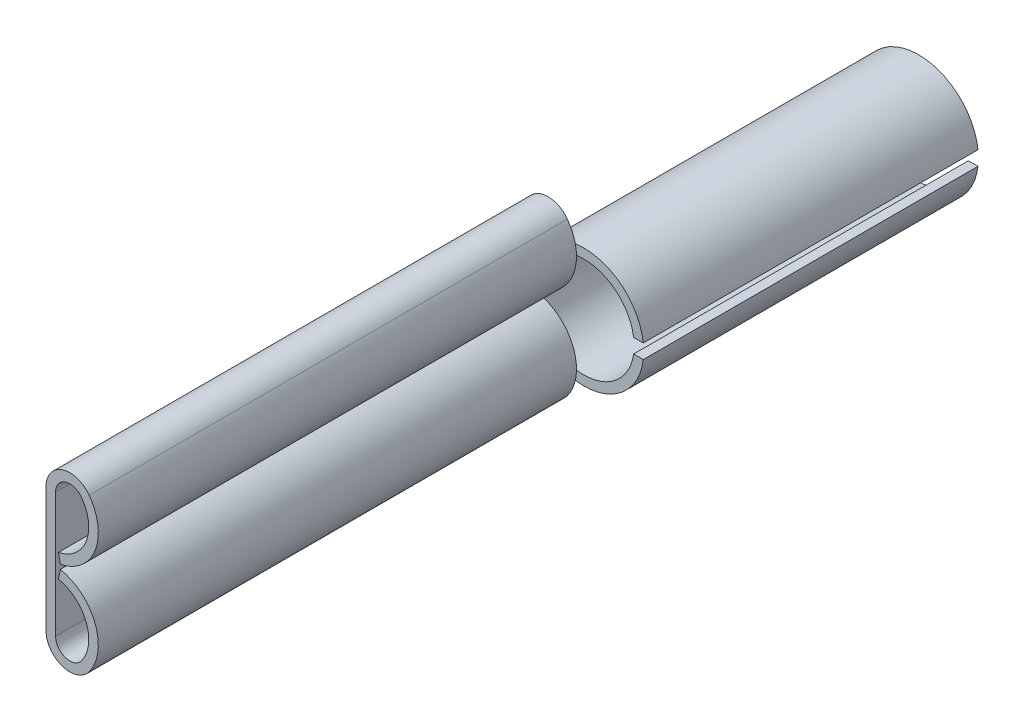
ISO-10303-21;
HEADER;
FILE_DESCRIPTION(('STEP AP214'),'2;1');
FILE_NAME('part.step','',(''),(''),'','','');
FILE_SCHEMA(('AUTOMOTIVE_DESIGN { 1 0 10303 214 1 1 1 1 }'));
ENDSEC;
DATA;
#1=APPLICATION_CONTEXT('core data for automotive mechanical design processes');
#2=APPLICATION_PROTOCOL_DEFINITION('international standard','automotive_design',2000,#1);
#3=PRODUCT_CONTEXT('',#1,'mechanical');
#4=PRODUCT('Part','Part','',(#3));
#5=PRODUCT_RELATED_PRODUCT_CATEGORY('part','',(#4));
#6=PRODUCT_DEFINITION_FORMATION('','',#4);
#7=PRODUCT_DEFINITION_CONTEXT('part definition',#1,'design');
#8=PRODUCT_DEFINITION('design','',#6,#7);
#9=PRODUCT_DEFINITION_SHAPE('','',#8);
#10=(LENGTH_UNIT() NAMED_UNIT(*) SI_UNIT(.MILLI.,.METRE.));
#11=(NAMED_UNIT(*) PLANE_ANGLE_UNIT() SI_UNIT($,.RADIAN.));
#12=(NAMED_UNIT(*) SI_UNIT($,.STERADIAN.) SOLID_ANGLE_UNIT());
#13=UNCERTAINTY_MEASURE_WITH_UNIT(LENGTH_MEASURE(1.E-05),#10,'distance_accuracy_value','');
#14=(GEOMETRIC_REPRESENTATION_CONTEXT(3) GLOBAL_UNCERTAINTY_ASSIGNED_CONTEXT((#13)) GLOBAL_UNIT_ASSIGNED_CONTEXT((#10,
#11,#12)) REPRESENTATION_CONTEXT('',''));
#15=CARTESIAN_POINT('',(0.,0.,0.));
#16=DIRECTION('',(0.,0.,1.));
#17=DIRECTION('',(1.,0.,0.));
#18=AXIS2_PLACEMENT_3D('',#15,#16,#17);
#19=CARTESIAN_POINT('',(0.104531081865318,3.01622247339028,0.));
#20=DIRECTION('',(0.,0.,-1.));
#21=DIRECTION('',(-1.,0.,0.));
#22=AXIS2_PLACEMENT_3D('',#19,#20,#21);
#23=PLANE('',#22);
#24=CARTESIAN_POINT('',(1.25,2.,0.));
#25=DIRECTION('',(0.,0.,1.));
#26=DIRECTION('',(-1.,0.,0.));
#27=AXIS2_PLACEMENT_3D('',#24,#25,#26);
#28=CIRCLE('',#27,1.05);
#29=CARTESIAN_POINT('',(0.893326067712205,1.01243546741169,0.));
#30=VERTEX_POINT('',#29);
#31=CARTESIAN_POINT('',(1.09360041260863,0.961713349279781,0.));
#32=VERTEX_POINT('',#31);
#33=EDGE_CURVE('E37',#30,#32,#28,.T.);
#34=ORIENTED_EDGE('',*,*,#33,.F.);
#35=CARTESIAN_POINT('',(0.104531081865318,0.983777526609717,0.));
#36=DIRECTION('',(0.,0.,-1.));
#37=DIRECTION('',(-1.,0.,0.));
#38=AXIS2_PLACEMENT_3D('',#35,#36,#37);
#39=CIRCLE('',#38,0.789315404175163);
#40=CARTESIAN_POINT('',(0.260484003926401,1.75753297464793,0.));
#41=VERTEX_POINT('',#40);
#42=EDGE_CURVE('E234',#41,#30,#39,.T.);
#43=ORIENTED_EDGE('',*,*,#42,.F.);
#44=DIRECTION('',(-0.197579980367994,-0.980286769959578,0.));
#45=VECTOR('',#44,1.);
#46=CARTESIAN_POINT('',(0.3,1.95359032863984,0.));
#47=LINE('',#46,#45);
#48=CARTESIAN_POINT('',(0.3,1.95359032863984,0.));
#49=VERTEX_POINT('',#48);
#50=EDGE_CURVE('E230',#49,#41,#47,.T.);
#51=ORIENTED_EDGE('',*,*,#50,.F.);
#52=CARTESIAN_POINT('',(0.104531081865318,0.983777526609717,0.));
#53=DIRECTION('',(0.,0.,1.));
#54=DIRECTION('',(-1.,0.,0.));
#55=AXIS2_PLACEMENT_3D('',#52,#53,#54);
#56=CIRCLE('',#55,0.989315404175163);
#57=EDGE_CURVE('E54',#32,#49,#56,.T.);
#58=ORIENTED_EDGE('',*,*,#57,.F.);
#59=EDGE_LOOP('',(#34,#43,#51,#58));
#60=FACE_BOUND('',#59,.T.);
#61=ADVANCED_FACE('F28',(#60),#23,.T.);
#62=CARTESIAN_POINT('',(1.25,2.,0.));
#63=DIRECTION('',(0.,0.,-1.));
#64=DIRECTION('',(-1.,0.,0.));
#65=AXIS2_PLACEMENT_3D('',#62,#63,#64);
#66=CIRCLE('',#65,1.25);
#67=CARTESIAN_POINT('',(1.06893914052776,0.763182727656516,0.));
#68=VERTEX_POINT('',#67);
#69=CARTESIAN_POINT('',(0.874000182773937,0.80789088693779,0.));
#70=VERTEX_POINT('',#69);
#71=EDGE_CURVE('E329',#68,#70,#66,.T.);
#72=ORIENTED_EDGE('',*,*,#71,.F.);
#73=CARTESIAN_POINT('',(0.904104300375872,0.401173340923638,0.));
#74=VERTEX_POINT('',#73);
#75=EDGE_CURVE('E227',#74,#68,#56,.T.);
#76=ORIENTED_EDGE('',*,*,#75,.F.);
#77=CARTESIAN_POINT('',(0.5,0.695621493265824,0.));
#78=DIRECTION('',(0.,0.,1.));
#79=DIRECTION('',(-1.,0.,0.));
#80=AXIS2_PLACEMENT_3D('',#77,#78,#79);
#81=CIRCLE('',#80,0.5);
#82=CARTESIAN_POINT('',(0.,0.695621493265824,0.));
#83=VERTEX_POINT('',#82);
#84=EDGE_CURVE('E225',#83,#74,#81,.T.);
#85=ORIENTED_EDGE('',*,*,#84,.F.);
#86=DIRECTION('',(0.,-1.,0.));
#87=VECTOR('',#86,1.);
#88=CARTESIAN_POINT('',(0.,0.695621493265824,0.));
#89=LINE('',#88,#87);
#90=CARTESIAN_POINT('',(0.,2.,0.));
#91=VERTEX_POINT('',#90);
#92=EDGE_CURVE('E221',#91,#83,#89,.T.);
#93=ORIENTED_EDGE('',*,*,#92,.F.);
#94=CARTESIAN_POINT('',(0.2,1.32176700168747,0.));
#95=VERTEX_POINT('',#94);
#96=EDGE_CURVE('E321',#95,#91,#66,.T.);
#97=ORIENTED_EDGE('',*,*,#96,.F.);
#98=DIRECTION('',(0.,1.,0.));
#99=VECTOR('',#98,1.);
#100=CARTESIAN_POINT('',(0.2,0.695621493265824,0.));
#101=LINE('',#100,#99);
#102=CARTESIAN_POINT('',(0.2,0.695621493265824,0.));
#103=VERTEX_POINT('',#102);
#104=EDGE_CURVE('E241',#103,#95,#101,.T.);
#105=ORIENTED_EDGE('',*,*,#104,.F.);
#106=CARTESIAN_POINT('',(0.5,0.695621493265824,0.));
#107=DIRECTION('',(0.,0.,-1.));
#108=DIRECTION('',(-1.,0.,0.));
#109=AXIS2_PLACEMENT_3D('',#106,#107,#108);
#110=CIRCLE('',#109,0.3);
#111=CARTESIAN_POINT('',(0.742462580225523,0.518952601860512,0.));
#112=VERTEX_POINT('',#111);
#113=EDGE_CURVE('E237',#112,#103,#110,.T.);
#114=ORIENTED_EDGE('',*,*,#113,.F.);
#115=EDGE_CURVE('E233',#70,#112,#39,.T.);
#116=ORIENTED_EDGE('',*,*,#115,.F.);
#117=EDGE_LOOP('',(#72,#76,#85,#93,#97,#105,#114,#116));
#118=FACE_BOUND('',#117,.T.);
#119=ADVANCED_FACE('F371',(#118),#23,.T.);
#120=CARTESIAN_POINT('',(1.09360041260863,3.03828665072022,0.));
#121=VERTEX_POINT('',#120);
#122=CARTESIAN_POINT('',(0.893326067712205,2.98756453258831,0.));
#123=VERTEX_POINT('',#122);
#124=EDGE_CURVE('E11',#121,#123,#28,.T.);
#125=ORIENTED_EDGE('',*,*,#124,.F.);
#126=CARTESIAN_POINT('',(0.104531081865318,3.01622247339028,0.));
#127=DIRECTION('',(0.,0.,1.));
#128=DIRECTION('',(-1.,0.,0.));
#129=AXIS2_PLACEMENT_3D('',#126,#127,#128);
#130=CIRCLE('',#129,0.989315404175163);
#131=CARTESIAN_POINT('',(0.3,2.04640967136016,0.));
#132=VERTEX_POINT('',#131);
#133=EDGE_CURVE('E213',#132,#121,#130,.T.);
#134=ORIENTED_EDGE('',*,*,#133,.F.);
#135=DIRECTION('',(0.197579980367994,-0.980286769959578,0.));
#136=VECTOR('',#135,1.);
#137=CARTESIAN_POINT('',(0.260484003926401,2.24246702535207,0.));
#138=LINE('',#137,#136);
#139=CARTESIAN_POINT('',(0.260484003926401,2.24246702535207,0.));
#140=VERTEX_POINT('',#139);
#141=EDGE_CURVE('E251',#140,#132,#138,.T.);
#142=ORIENTED_EDGE('',*,*,#141,.F.);
#143=CARTESIAN_POINT('',(0.104531081865318,3.01622247339028,0.));
#144=DIRECTION('',(0.,0.,-1.));
#145=DIRECTION('',(-1.,0.,0.));
#146=AXIS2_PLACEMENT_3D('',#143,#144,#145);
#147=CIRCLE('',#146,0.789315404175163);
#148=EDGE_CURVE('E247',#123,#140,#147,.T.);
#149=ORIENTED_EDGE('',*,*,#148,.F.);
#150=EDGE_LOOP('',(#125,#134,#142,#149));
#151=FACE_BOUND('',#150,.T.);
#152=ADVANCED_FACE('F356',(#151),#23,.T.);
#153=CARTESIAN_POINT('',(0.104531081865318,3.01622247339028,10.));
#154=DIRECTION('',(0.,0.,-1.));
#155=DIRECTION('',(-1.,0.,0.));
#156=AXIS2_PLACEMENT_3D('',#153,#154,#155);
#157=CYLINDRICAL_SURFACE('',#156,0.989315404175163);
#158=ORIENTED_EDGE('',*,*,#133,.T.);
#159=CARTESIAN_POINT('',(1.06893914052776,3.23681727234348,0.));
#160=VERTEX_POINT('',#159);
#161=EDGE_CURVE('E211',#121,#160,#130,.T.);
#162=ORIENTED_EDGE('',*,*,#161,.T.);
#163=CARTESIAN_POINT('',(0.904104300375872,3.59882665907636,0.));
#164=VERTEX_POINT('',#163);
#165=EDGE_CURVE('E208',#160,#164,#130,.T.);
#166=ORIENTED_EDGE('',*,*,#165,.T.);
#167=DIRECTION('',(0.,0.,-1.));
#168=VECTOR('',#167,1.);
#169=CARTESIAN_POINT('',(0.904104300375872,3.59882665907636,10.));
#170=LINE('',#169,#168);
#171=CARTESIAN_POINT('',(0.904104300375872,3.59882665907636,10.));
#172=VERTEX_POINT('',#171);
#173=EDGE_CURVE('E32',#172,#164,#170,.T.);
#174=ORIENTED_EDGE('',*,*,#173,.F.);
#175=CARTESIAN_POINT('',(0.104531081865318,3.01622247339028,10.));
#176=DIRECTION('',(0.,0.,1.));
#177=DIRECTION('',(-1.,0.,0.));
#178=AXIS2_PLACEMENT_3D('',#175,#176,#177);
#179=CIRCLE('',#178,0.989315404175163);
#180=CARTESIAN_POINT('',(0.3,2.04640967136016,10.));
#181=VERTEX_POINT('',#180);
#182=EDGE_CURVE('E254',#181,#172,#179,.T.);
#183=ORIENTED_EDGE('',*,*,#182,.F.);
#184=DIRECTION('',(0.,0.,-1.));
#185=VECTOR('',#184,1.);
#186=CARTESIAN_POINT('',(0.3,2.04640967136016,10.));
#187=LINE('',#186,#185);
#188=EDGE_CURVE('E279',#181,#132,#187,.T.);
#189=ORIENTED_EDGE('',*,*,#188,.T.);
#190=EDGE_LOOP('',(#158,#162,#166,#174,#183,#189));
#191=FACE_BOUND('',#190,.T.);
#192=ADVANCED_FACE('F30',(#191),#157,.T.);
#193=CARTESIAN_POINT('',(0.5,3.30437850673418,10.));
#194=DIRECTION('',(0.,0.,-1.));
#195=DIRECTION('',(-1.,0.,0.));
#196=AXIS2_PLACEMENT_3D('',#193,#194,#195);
#197=CYLINDRICAL_SURFACE('',#196,0.5);
#198=CARTESIAN_POINT('',(0.5,3.30437850673418,0.));
#199=DIRECTION('',(0.,0.,1.));
#200=DIRECTION('',(-1.,0.,0.));
#201=AXIS2_PLACEMENT_3D('',#198,#199,#200);
#202=CIRCLE('',#201,0.5);
#203=CARTESIAN_POINT('',(0.,3.30437850673418,0.));
#204=VERTEX_POINT('',#203);
#205=EDGE_CURVE('E219',#164,#204,#202,.T.);
#206=ORIENTED_EDGE('',*,*,#205,.T.);
#207=DIRECTION('',(0.,0.,-1.));
#208=VECTOR('',#207,1.);
#209=CARTESIAN_POINT('',(0.,3.30437850673418,10.));
#210=LINE('',#209,#208);
#211=CARTESIAN_POINT('',(0.,3.30437850673418,10.));
#212=VERTEX_POINT('',#211);
#213=EDGE_CURVE('E308',#212,#204,#210,.T.);
#214=ORIENTED_EDGE('',*,*,#213,.F.);
#215=CARTESIAN_POINT('',(0.5,3.30437850673418,10.));
#216=DIRECTION('',(0.,0.,1.));
#217=DIRECTION('',(-1.,0.,0.));
#218=AXIS2_PLACEMENT_3D('',#215,#216,#217);
#219=CIRCLE('',#218,0.5);
#220=EDGE_CURVE('E257',#172,#212,#219,.T.);
#221=ORIENTED_EDGE('',*,*,#220,.F.);
#222=ORIENTED_EDGE('',*,*,#173,.T.);
#223=EDGE_LOOP('',(#206,#214,#221,#222));
#224=FACE_BOUND('',#223,.T.);
#225=ADVANCED_FACE('F417',(#224),#197,.T.);
#226=CARTESIAN_POINT('',(0.,0.695621493265824,10.));
#227=DIRECTION('',(1.,0.,0.));
#228=DIRECTION('',(0.,0.,-1.));
#229=AXIS2_PLACEMENT_3D('',#226,#227,#228);
#230=PLANE('',#229);
#231=EDGE_CURVE('E222',#204,#91,#89,.T.);
#232=ORIENTED_EDGE('',*,*,#231,.T.);
#233=ORIENTED_EDGE('',*,*,#92,.T.);
#234=DIRECTION('',(0.,0.,-1.));
#235=VECTOR('',#234,1.);
#236=CARTESIAN_POINT('',(0.,0.695621493265824,10.));
#237=LINE('',#236,#235);
#238=CARTESIAN_POINT('',(0.,0.695621493265824,10.));
#239=VERTEX_POINT('',#238);
#240=EDGE_CURVE('E306',#239,#83,#237,.T.);
#241=ORIENTED_EDGE('',*,*,#240,.F.);
#242=DIRECTION('',(0.,-1.,0.));
#243=VECTOR('',#242,1.);
#244=CARTESIAN_POINT('',(0.,0.695621493265824,10.));
#245=LINE('',#244,#243);
#246=EDGE_CURVE('E259',#212,#239,#245,.T.);
#247=ORIENTED_EDGE('',*,*,#246,.F.);
#248=ORIENTED_EDGE('',*,*,#213,.T.);
#249=EDGE_LOOP('',(#232,#233,#241,#247,#248));
#250=FACE_BOUND('',#249,.T.);
#251=ADVANCED_FACE('F415',(#250),#230,.F.);
#252=CARTESIAN_POINT('',(0.5,0.695621493265824,10.));
#253=DIRECTION('',(0.,0.,-1.));
#254=DIRECTION('',(-1.,0.,0.));
#255=AXIS2_PLACEMENT_3D('',#252,#253,#254);
#256=CYLINDRICAL_SURFACE('',#255,0.5);
#257=ORIENTED_EDGE('',*,*,#84,.T.);
#258=DIRECTION('',(0.,0.,-1.));
#259=VECTOR('',#258,1.);
#260=CARTESIAN_POINT('',(0.904104300375872,0.401173340923639,10.));
#261=LINE('',#260,#259);
#262=CARTESIAN_POINT('',(0.904104300375872,0.401173340923639,10.));
#263=VERTEX_POINT('',#262);
#264=EDGE_CURVE('E303',#263,#74,#261,.T.);
#265=ORIENTED_EDGE('',*,*,#264,.F.);
#266=CARTESIAN_POINT('',(0.5,0.695621493265824,10.));
#267=DIRECTION('',(0.,0.,1.));
#268=DIRECTION('',(-1.,0.,0.));
#269=AXIS2_PLACEMENT_3D('',#266,#267,#268);
#270=CIRCLE('',#269,0.5);
#271=EDGE_CURVE('E261',#239,#263,#270,.T.);
#272=ORIENTED_EDGE('',*,*,#271,.F.);
#273=ORIENTED_EDGE('',*,*,#240,.T.);
#274=EDGE_LOOP('',(#257,#265,#272,#273));
#275=FACE_BOUND('',#274,.T.);
#276=ADVANCED_FACE('F412',(#275),#256,.T.);
#277=CARTESIAN_POINT('',(0.104531081865318,0.983777526609717,10.));
#278=DIRECTION('',(0.,0.,-1.));
#279=DIRECTION('',(-1.,0.,0.));
#280=AXIS2_PLACEMENT_3D('',#277,#278,#279);
#281=CYLINDRICAL_SURFACE('',#280,0.989315404175163);
#282=ORIENTED_EDGE('',*,*,#75,.T.);
#283=EDGE_CURVE('E231',#68,#32,#56,.T.);
#284=ORIENTED_EDGE('',*,*,#283,.T.);
#285=ORIENTED_EDGE('',*,*,#57,.T.);
#286=DIRECTION('',(0.,0.,-1.));
#287=VECTOR('',#286,1.);
#288=CARTESIAN_POINT('',(0.3,1.95359032863984,10.));
#289=LINE('',#288,#287);
#290=CARTESIAN_POINT('',(0.3,1.95359032863984,10.));
#291=VERTEX_POINT('',#290);
#292=EDGE_CURVE('E300',#291,#49,#289,.T.);
#293=ORIENTED_EDGE('',*,*,#292,.F.);
#294=CARTESIAN_POINT('',(0.104531081865318,0.983777526609717,10.));
#295=DIRECTION('',(0.,0.,1.));
#296=DIRECTION('',(-1.,0.,0.));
#297=AXIS2_PLACEMENT_3D('',#294,#295,#296);
#298=CIRCLE('',#297,0.989315404175163);
#299=EDGE_CURVE('E263',#263,#291,#298,.T.);
#300=ORIENTED_EDGE('',*,*,#299,.F.);
#301=ORIENTED_EDGE('',*,*,#264,.T.);
#302=EDGE_LOOP('',(#282,#284,#285,#293,#300,#301));
#303=FACE_BOUND('',#302,.T.);
#304=ADVANCED_FACE('F409',(#303),#281,.T.);
#305=CARTESIAN_POINT('',(0.3,1.95359032863984,10.));
#306=DIRECTION('',(0.980286769959579,-0.197579980367994,0.));
#307=DIRECTION('',(0.197579980367994,0.980286769959579,0.));
#308=AXIS2_PLACEMENT_3D('',#305,#306,#307);
#309=PLANE('',#308);
#310=ORIENTED_EDGE('',*,*,#50,.T.);
#311=DIRECTION('',(0.,0.,-1.));
#312=VECTOR('',#311,1.);
#313=CARTESIAN_POINT('',(0.260484003926401,1.75753297464793,10.));
#314=LINE('',#313,#312);
#315=CARTESIAN_POINT('',(0.260484003926401,1.75753297464793,10.));
#316=VERTEX_POINT('',#315);
#317=EDGE_CURVE('E297',#316,#41,#314,.T.);
#318=ORIENTED_EDGE('',*,*,#317,.F.);
#319=DIRECTION('',(-0.197579980367994,-0.980286769959578,0.));
#320=VECTOR('',#319,1.);
#321=CARTESIAN_POINT('',(0.3,1.95359032863984,10.));
#322=LINE('',#321,#320);
#323=EDGE_CURVE('E265',#291,#316,#322,.T.);
#324=ORIENTED_EDGE('',*,*,#323,.F.);
#325=ORIENTED_EDGE('',*,*,#292,.T.);
#326=EDGE_LOOP('',(#310,#318,#324,#325));
#327=FACE_BOUND('',#326,.T.);
#328=ADVANCED_FACE('F404',(#327),#309,.F.);
#329=CARTESIAN_POINT('',(0.104531081865318,0.983777526609717,10.));
#330=DIRECTION('',(0.,0.,-1.));
#331=DIRECTION('',(-1.,0.,0.));
#332=AXIS2_PLACEMENT_3D('',#329,#330,#331);
#333=CYLINDRICAL_SURFACE('',#332,0.789315404175163);
#334=ORIENTED_EDGE('',*,*,#42,.T.);
#335=EDGE_CURVE('E238',#30,#70,#39,.T.);
#336=ORIENTED_EDGE('',*,*,#335,.T.);
#337=ORIENTED_EDGE('',*,*,#115,.T.);
#338=DIRECTION('',(0.,0.,-1.));
#339=VECTOR('',#338,1.);
#340=CARTESIAN_POINT('',(0.742462580225523,0.518952601860512,10.));
#341=LINE('',#340,#339);
#342=CARTESIAN_POINT('',(0.742462580225523,0.518952601860512,10.));
#343=VERTEX_POINT('',#342);
#344=EDGE_CURVE('E294',#343,#112,#341,.T.);
#345=ORIENTED_EDGE('',*,*,#344,.F.);
#346=CARTESIAN_POINT('',(0.104531081865318,0.983777526609717,10.));
#347=DIRECTION('',(0.,0.,-1.));
#348=DIRECTION('',(-1.,0.,0.));
#349=AXIS2_PLACEMENT_3D('',#346,#347,#348);
#350=CIRCLE('',#349,0.789315404175163);
#351=EDGE_CURVE('E267',#316,#343,#350,.T.);
#352=ORIENTED_EDGE('',*,*,#351,.F.);
#353=ORIENTED_EDGE('',*,*,#317,.T.);
#354=EDGE_LOOP('',(#334,#336,#337,#345,#352,#353));
#355=FACE_BOUND('',#354,.T.);
#356=ADVANCED_FACE('F400',(#355),#333,.F.);
#357=CARTESIAN_POINT('',(0.5,0.695621493265824,10.));
#358=DIRECTION('',(0.,0.,-1.));
#359=DIRECTION('',(-1.,0.,0.));
#360=AXIS2_PLACEMENT_3D('',#357,#358,#359);
#361=CYLINDRICAL_SURFACE('',#360,0.3);
#362=ORIENTED_EDGE('',*,*,#113,.T.);
#363=DIRECTION('',(0.,0.,-1.));
#364=VECTOR('',#363,1.);
#365=CARTESIAN_POINT('',(0.2,0.695621493265824,10.));
#366=LINE('',#365,#364);
#367=CARTESIAN_POINT('',(0.2,0.695621493265824,10.));
#368=VERTEX_POINT('',#367);
#369=EDGE_CURVE('E291',#368,#103,#366,.T.);
#370=ORIENTED_EDGE('',*,*,#369,.F.);
#371=CARTESIAN_POINT('',(0.5,0.695621493265824,10.));
#372=DIRECTION('',(0.,0.,-1.));
#373=DIRECTION('',(-1.,0.,0.));
#374=AXIS2_PLACEMENT_3D('',#371,#372,#373);
#375=CIRCLE('',#374,0.3);
#376=EDGE_CURVE('E269',#343,#368,#375,.T.);
#377=ORIENTED_EDGE('',*,*,#376,.F.);
#378=ORIENTED_EDGE('',*,*,#344,.T.);
#379=EDGE_LOOP('',(#362,#370,#377,#378));
#380=FACE_BOUND('',#379,.T.);
#381=ADVANCED_FACE('F396',(#380),#361,.F.);
#382=CARTESIAN_POINT('',(0.2,0.695621493265824,10.));
#383=DIRECTION('',(-1.,0.,0.));
#384=DIRECTION('',(0.,-1.,0.));
#385=AXIS2_PLACEMENT_3D('',#382,#383,#384);
#386=PLANE('',#385);
#387=ORIENTED_EDGE('',*,*,#104,.T.);
#388=CARTESIAN_POINT('',(0.2,2.,0.));
#389=VERTEX_POINT('',#388);
#390=EDGE_CURVE('E245',#95,#389,#101,.T.);
#391=ORIENTED_EDGE('',*,*,#390,.T.);
#392=CARTESIAN_POINT('',(0.2,2.67823299831253,0.));
#393=VERTEX_POINT('',#392);
#394=EDGE_CURVE('E341',#389,#393,#101,.T.);
#395=ORIENTED_EDGE('',*,*,#394,.T.);
#396=CARTESIAN_POINT('',(0.2,3.30437850673418,0.));
#397=VERTEX_POINT('',#396);
#398=EDGE_CURVE('E240',#393,#397,#101,.T.);
#399=ORIENTED_EDGE('',*,*,#398,.T.);
#400=DIRECTION('',(0.,0.,-1.));
#401=VECTOR('',#400,1.);
#402=CARTESIAN_POINT('',(0.2,3.30437850673418,10.));
#403=LINE('',#402,#401);
#404=CARTESIAN_POINT('',(0.2,3.30437850673418,10.));
#405=VERTEX_POINT('',#404);
#406=EDGE_CURVE('E288',#405,#397,#403,.T.);
#407=ORIENTED_EDGE('',*,*,#406,.F.);
#408=DIRECTION('',(0.,1.,0.));
#409=VECTOR('',#408,1.);
#410=CARTESIAN_POINT('',(0.2,0.695621493265824,10.));
#411=LINE('',#410,#409);
#412=EDGE_CURVE('E271',#368,#405,#411,.T.);
#413=ORIENTED_EDGE('',*,*,#412,.F.);
#414=ORIENTED_EDGE('',*,*,#369,.T.);
#415=EDGE_LOOP('',(#387,#391,#395,#399,#407,#413,#414));
#416=FACE_BOUND('',#415,.T.);
#417=ADVANCED_FACE('F376',(#416),#386,.F.);
#418=CARTESIAN_POINT('',(0.5,3.30437850673418,10.));
#419=DIRECTION('',(0.,0.,-1.));
#420=DIRECTION('',(-1.,0.,0.));
#421=AXIS2_PLACEMENT_3D('',#418,#419,#420);
#422=CYLINDRICAL_SURFACE('',#421,0.3);
#423=CARTESIAN_POINT('',(0.5,3.30437850673418,0.));
#424=DIRECTION('',(0.,0.,-1.));
#425=DIRECTION('',(-1.,0.,0.));
#426=AXIS2_PLACEMENT_3D('',#423,#424,#425);
#427=CIRCLE('',#426,0.3);
#428=CARTESIAN_POINT('',(0.742462580225523,3.48104739813949,0.));
#429=VERTEX_POINT('',#428);
#430=EDGE_CURVE('E244',#397,#429,#427,.T.);
#431=ORIENTED_EDGE('',*,*,#430,.T.);
#432=DIRECTION('',(0.,0.,-1.));
#433=VECTOR('',#432,1.);
#434=CARTESIAN_POINT('',(0.742462580225523,3.48104739813949,10.));
#435=LINE('',#434,#433);
#436=CARTESIAN_POINT('',(0.742462580225523,3.48104739813949,10.));
#437=VERTEX_POINT('',#436);
#438=EDGE_CURVE('E285',#437,#429,#435,.T.);
#439=ORIENTED_EDGE('',*,*,#438,.F.);
#440=CARTESIAN_POINT('',(0.5,3.30437850673418,10.));
#441=DIRECTION('',(0.,0.,-1.));
#442=DIRECTION('',(-1.,0.,0.));
#443=AXIS2_PLACEMENT_3D('',#440,#441,#442);
#444=CIRCLE('',#443,0.3);
#445=EDGE_CURVE('E273',#405,#437,#444,.T.);
#446=ORIENTED_EDGE('',*,*,#445,.F.);
#447=ORIENTED_EDGE('',*,*,#406,.T.);
#448=EDGE_LOOP('',(#431,#439,#446,#447));
#449=FACE_BOUND('',#448,.T.);
#450=ADVANCED_FACE('F386',(#449),#422,.F.);
#451=CARTESIAN_POINT('',(0.104531081865318,3.01622247339028,10.));
#452=DIRECTION('',(0.,0.,-1.));
#453=DIRECTION('',(-1.,0.,0.));
#454=AXIS2_PLACEMENT_3D('',#451,#452,#453);
#455=CYLINDRICAL_SURFACE('',#454,0.789315404175163);
#456=CARTESIAN_POINT('',(0.874000182773937,3.19210911306221,0.));
#457=VERTEX_POINT('',#456);
#458=EDGE_CURVE('E248',#429,#457,#147,.T.);
#459=ORIENTED_EDGE('',*,*,#458,.T.);
#460=EDGE_CURVE('E252',#457,#123,#147,.T.);
#461=ORIENTED_EDGE('',*,*,#460,.T.);
#462=ORIENTED_EDGE('',*,*,#148,.T.);
#463=DIRECTION('',(0.,0.,-1.));
#464=VECTOR('',#463,1.);
#465=CARTESIAN_POINT('',(0.260484003926401,2.24246702535207,10.));
#466=LINE('',#465,#464);
#467=CARTESIAN_POINT('',(0.260484003926401,2.24246702535207,10.));
#468=VERTEX_POINT('',#467);
#469=EDGE_CURVE('E282',#468,#140,#466,.T.);
#470=ORIENTED_EDGE('',*,*,#469,.F.);
#471=CARTESIAN_POINT('',(0.104531081865318,3.01622247339028,10.));
#472=DIRECTION('',(0.,0.,-1.));
#473=DIRECTION('',(-1.,0.,0.));
#474=AXIS2_PLACEMENT_3D('',#471,#472,#473);
#475=CIRCLE('',#474,0.789315404175163);
#476=EDGE_CURVE('E275',#437,#468,#475,.T.);
#477=ORIENTED_EDGE('',*,*,#476,.F.);
#478=ORIENTED_EDGE('',*,*,#438,.T.);
#479=EDGE_LOOP('',(#459,#461,#462,#470,#477,#478));
#480=FACE_BOUND('',#479,.T.);
#481=ADVANCED_FACE('F347',(#480),#455,.F.);
#482=CARTESIAN_POINT('',(0.260484003926401,2.24246702535207,10.));
#483=DIRECTION('',(0.980286769959578,0.197579980367994,0.));
#484=DIRECTION('',(-0.197579980367994,0.980286769959579,0.));
#485=AXIS2_PLACEMENT_3D('',#482,#483,#484);
#486=PLANE('',#485);
#487=ORIENTED_EDGE('',*,*,#141,.T.);
#488=ORIENTED_EDGE('',*,*,#188,.F.);
#489=DIRECTION('',(0.197579980367994,-0.980286769959578,0.));
#490=VECTOR('',#489,1.);
#491=CARTESIAN_POINT('',(0.260484003926401,2.24246702535207,10.));
#492=LINE('',#491,#490);
#493=EDGE_CURVE('E277',#468,#181,#492,.T.);
#494=ORIENTED_EDGE('',*,*,#493,.F.);
#495=ORIENTED_EDGE('',*,*,#469,.T.);
#496=EDGE_LOOP('',(#487,#488,#494,#495));
#497=FACE_BOUND('',#496,.T.);
#498=ADVANCED_FACE('F353',(#497),#486,.F.);
#499=CARTESIAN_POINT('',(0.104531081865318,3.01622247339028,10.));
#500=DIRECTION('',(0.,0.,-1.));
#501=DIRECTION('',(-1.,0.,0.));
#502=AXIS2_PLACEMENT_3D('',#499,#500,#501);
#503=PLANE('',#502);
#504=ORIENTED_EDGE('',*,*,#182,.T.);
#505=ORIENTED_EDGE('',*,*,#220,.T.);
#506=ORIENTED_EDGE('',*,*,#246,.T.);
#507=ORIENTED_EDGE('',*,*,#271,.T.);
#508=ORIENTED_EDGE('',*,*,#299,.T.);
#509=ORIENTED_EDGE('',*,*,#323,.T.);
#510=ORIENTED_EDGE('',*,*,#351,.T.);
#511=ORIENTED_EDGE('',*,*,#376,.T.);
#512=ORIENTED_EDGE('',*,*,#412,.T.);
#513=ORIENTED_EDGE('',*,*,#445,.T.);
#514=ORIENTED_EDGE('',*,*,#476,.T.);
#515=ORIENTED_EDGE('',*,*,#493,.T.);
#516=EDGE_LOOP('',(#504,#505,#506,#507,#508,#509,#510,#511,#512,#513,#514,#515));
#517=FACE_BOUND('',#516,.T.);
#518=ADVANCED_FACE('F391',(#517),#503,.F.);
#519=EDGE_CURVE('E46',#91,#393,#66,.T.);
#520=ORIENTED_EDGE('',*,*,#519,.F.);
#521=ORIENTED_EDGE('',*,*,#231,.F.);
#522=ORIENTED_EDGE('',*,*,#205,.F.);
#523=ORIENTED_EDGE('',*,*,#165,.F.);
#524=EDGE_CURVE('E314',#457,#160,#66,.T.);
#525=ORIENTED_EDGE('',*,*,#524,.F.);
#526=ORIENTED_EDGE('',*,*,#458,.F.);
#527=ORIENTED_EDGE('',*,*,#430,.F.);
#528=ORIENTED_EDGE('',*,*,#398,.F.);
#529=EDGE_LOOP('',(#520,#521,#522,#523,#525,#526,#527,#528));
#530=FACE_BOUND('',#529,.T.);
#531=ADVANCED_FACE('F389',(#530),#23,.T.);
#532=CARTESIAN_POINT('',(1.25,2.,0.));
#533=DIRECTION('',(0.,0.,-1.));
#534=DIRECTION('',(-1.,0.,0.));
#535=AXIS2_PLACEMENT_3D('',#532,#533,#534);
#536=PLANE('',#535);
#537=ORIENTED_EDGE('',*,*,#161,.F.);
#538=CARTESIAN_POINT('',(2.28923048454133,2.15,0.));
#539=VERTEX_POINT('',#538);
#540=EDGE_CURVE('E194',#539,#121,#28,.T.);
#541=ORIENTED_EDGE('',*,*,#540,.F.);
#542=DIRECTION('',(-1.,0.,0.));
#543=VECTOR('',#542,1.);
#544=CARTESIAN_POINT('',(2.49096736459909,2.15,0.));
#545=LINE('',#544,#543);
#546=CARTESIAN_POINT('',(2.49096736459909,2.15,0.));
#547=VERTEX_POINT('',#546);
#548=EDGE_CURVE('E323',#547,#539,#545,.T.);
#549=ORIENTED_EDGE('',*,*,#548,.F.);
#550=EDGE_CURVE('E203',#160,#547,#66,.T.);
#551=ORIENTED_EDGE('',*,*,#550,.F.);
#552=EDGE_LOOP('',(#537,#541,#549,#551));
#553=FACE_BOUND('',#552,.T.);
#554=ADVANCED_FACE('F363',(#553),#536,.F.);
#555=ORIENTED_EDGE('',*,*,#390,.F.);
#556=EDGE_CURVE('E324',#70,#95,#66,.T.);
#557=ORIENTED_EDGE('',*,*,#556,.F.);
#558=ORIENTED_EDGE('',*,*,#335,.F.);
#559=EDGE_CURVE('E193',#389,#30,#28,.T.);
#560=ORIENTED_EDGE('',*,*,#559,.F.);
#561=EDGE_LOOP('',(#555,#557,#558,#560));
#562=FACE_BOUND('',#561,.T.);
#563=ADVANCED_FACE('F380',(#562),#536,.F.);
#564=ORIENTED_EDGE('',*,*,#460,.F.);
#565=EDGE_CURVE('E328',#393,#457,#66,.T.);
#566=ORIENTED_EDGE('',*,*,#565,.F.);
#567=ORIENTED_EDGE('',*,*,#394,.F.);
#568=EDGE_CURVE('E39',#123,#389,#28,.T.);
#569=ORIENTED_EDGE('',*,*,#568,.F.);
#570=EDGE_LOOP('',(#564,#566,#567,#569));
#571=FACE_BOUND('',#570,.T.);
#572=ADVANCED_FACE('F339',(#571),#536,.F.);
#573=CARTESIAN_POINT('',(1.25,2.,-7.));
#574=DIRECTION('',(0.,0.,1.));
#575=DIRECTION('',(1.,0.,0.));
#576=AXIS2_PLACEMENT_3D('',#573,#574,#575);
#577=CYLINDRICAL_SURFACE('',#576,1.05);
#578=ORIENTED_EDGE('',*,*,#540,.T.);
#579=ORIENTED_EDGE('',*,*,#124,.T.);
#580=ORIENTED_EDGE('',*,*,#568,.T.);
#581=ORIENTED_EDGE('',*,*,#559,.T.);
#582=ORIENTED_EDGE('',*,*,#33,.T.);
#583=CARTESIAN_POINT('',(2.28923048454133,1.85,0.));
#584=VERTEX_POINT('',#583);
#585=EDGE_CURVE('E183',#32,#584,#28,.T.);
#586=ORIENTED_EDGE('',*,*,#585,.T.);
#587=DIRECTION('',(0.,0.,1.));
#588=VECTOR('',#587,1.);
#589=CARTESIAN_POINT('',(2.28923048454133,1.85,-7.));
#590=LINE('',#589,#588);
#591=CARTESIAN_POINT('',(2.28923048454133,1.85,-7.));
#592=VERTEX_POINT('',#591);
#593=EDGE_CURVE('E189',#592,#584,#590,.T.);
#594=ORIENTED_EDGE('',*,*,#593,.F.);
#595=CARTESIAN_POINT('',(1.25,2.,-7.));
#596=DIRECTION('',(0.,0.,1.));
#597=DIRECTION('',(-1.,0.,0.));
#598=AXIS2_PLACEMENT_3D('',#595,#596,#597);
#599=CIRCLE('',#598,1.05);
#600=CARTESIAN_POINT('',(2.28923048454133,2.15,-7.));
#601=VERTEX_POINT('',#600);
#602=EDGE_CURVE('E326',#601,#592,#599,.T.);
#603=ORIENTED_EDGE('',*,*,#602,.F.);
#604=DIRECTION('',(0.,0.,1.));
#605=VECTOR('',#604,1.);
#606=CARTESIAN_POINT('',(2.28923048454133,2.15,-7.));
#607=LINE('',#606,#605);
#608=EDGE_CURVE('E367',#601,#539,#607,.T.);
#609=ORIENTED_EDGE('',*,*,#608,.T.);
#610=EDGE_LOOP('',(#578,#579,#580,#581,#582,#586,#594,#603,#609));
#611=FACE_BOUND('',#610,.T.);
#612=ADVANCED_FACE('F186',(#611),#577,.F.);
#613=CARTESIAN_POINT('',(2.49096736459909,1.85,-7.));
#614=DIRECTION('',(0.,-1.,0.));
#615=DIRECTION('',(0.,0.,-1.));
#616=AXIS2_PLACEMENT_3D('',#613,#614,#615);
#617=PLANE('',#616);
#618=DIRECTION('',(1.,0.,0.));
#619=VECTOR('',#618,1.);
#620=CARTESIAN_POINT('',(2.49096736459909,1.85,0.));
#621=LINE('',#620,#619);
#622=CARTESIAN_POINT('',(2.49096736459909,1.85,0.));
#623=VERTEX_POINT('',#622);
#624=EDGE_CURVE('E196',#584,#623,#621,.T.);
#625=ORIENTED_EDGE('',*,*,#624,.T.);
#626=DIRECTION('',(0.,0.,1.));
#627=VECTOR('',#626,1.);
#628=CARTESIAN_POINT('',(2.49096736459909,1.85,-7.));
#629=LINE('',#628,#627);
#630=CARTESIAN_POINT('',(2.49096736459909,1.85,-7.));
#631=VERTEX_POINT('',#630);
#632=EDGE_CURVE('E209',#631,#623,#629,.T.);
#633=ORIENTED_EDGE('',*,*,#632,.F.);
#634=DIRECTION('',(1.,0.,0.));
#635=VECTOR('',#634,1.);
#636=CARTESIAN_POINT('',(2.49096736459909,1.85,-7.));
#637=LINE('',#636,#635);
#638=EDGE_CURVE('E206',#592,#631,#637,.T.);
#639=ORIENTED_EDGE('',*,*,#638,.F.);
#640=ORIENTED_EDGE('',*,*,#593,.T.);
#641=EDGE_LOOP('',(#625,#633,#639,#640));
#642=FACE_BOUND('',#641,.T.);
#643=ADVANCED_FACE('F205',(#642),#617,.F.);
#644=CARTESIAN_POINT('',(1.25,2.,-7.));
#645=DIRECTION('',(0.,0.,1.));
#646=DIRECTION('',(1.,0.,0.));
#647=AXIS2_PLACEMENT_3D('',#644,#645,#646);
#648=CYLINDRICAL_SURFACE('',#647,1.25);
#649=EDGE_CURVE('E199',#623,#68,#66,.T.);
#650=ORIENTED_EDGE('',*,*,#649,.T.);
#651=ORIENTED_EDGE('',*,*,#71,.T.);
#652=ORIENTED_EDGE('',*,*,#556,.T.);
#653=ORIENTED_EDGE('',*,*,#96,.T.);
#654=ORIENTED_EDGE('',*,*,#519,.T.);
#655=ORIENTED_EDGE('',*,*,#565,.T.);
#656=ORIENTED_EDGE('',*,*,#524,.T.);
#657=ORIENTED_EDGE('',*,*,#550,.T.);
#658=DIRECTION('',(0.,0.,1.));
#659=VECTOR('',#658,1.);
#660=CARTESIAN_POINT('',(2.49096736459909,2.15,-7.));
#661=LINE('',#660,#659);
#662=CARTESIAN_POINT('',(2.49096736459909,2.15,-7.));
#663=VERTEX_POINT('',#662);
#664=EDGE_CURVE('E214',#663,#547,#661,.T.);
#665=ORIENTED_EDGE('',*,*,#664,.F.);
#666=CARTESIAN_POINT('',(1.25,2.,-7.));
#667=DIRECTION('',(0.,0.,-1.));
#668=DIRECTION('',(-1.,0.,0.));
#669=AXIS2_PLACEMENT_3D('',#666,#667,#668);
#670=CIRCLE('',#669,1.25);
#671=EDGE_CURVE('E616',#631,#663,#670,.T.);
#672=ORIENTED_EDGE('',*,*,#671,.F.);
#673=ORIENTED_EDGE('',*,*,#632,.T.);
#674=EDGE_LOOP('',(#650,#651,#652,#653,#654,#655,#656,#657,#665,#672,#673));
#675=FACE_BOUND('',#674,.T.);
#676=ADVANCED_FACE('F334',(#675),#648,.T.);
#677=CARTESIAN_POINT('',(2.49096736459909,2.15,-7.));
#678=DIRECTION('',(0.,1.,0.));
#679=DIRECTION('',(0.,0.,1.));
#680=AXIS2_PLACEMENT_3D('',#677,#678,#679);
#681=PLANE('',#680);
#682=ORIENTED_EDGE('',*,*,#548,.T.);
#683=ORIENTED_EDGE('',*,*,#608,.F.);
#684=DIRECTION('',(-1.,0.,0.));
#685=VECTOR('',#684,1.);
#686=CARTESIAN_POINT('',(2.49096736459909,2.15,-7.));
#687=LINE('',#686,#685);
#688=EDGE_CURVE('E614',#663,#601,#687,.T.);
#689=ORIENTED_EDGE('',*,*,#688,.F.);
#690=ORIENTED_EDGE('',*,*,#664,.T.);
#691=EDGE_LOOP('',(#682,#683,#689,#690));
#692=FACE_BOUND('',#691,.T.);
#693=ADVANCED_FACE('F583',(#692),#681,.F.);
#694=CARTESIAN_POINT('',(1.25,2.,-7.));
#695=DIRECTION('',(0.,0.,-1.));
#696=DIRECTION('',(-1.,0.,0.));
#697=AXIS2_PLACEMENT_3D('',#694,#695,#696);
#698=PLANE('',#697);
#699=ORIENTED_EDGE('',*,*,#602,.T.);
#700=ORIENTED_EDGE('',*,*,#638,.T.);
#701=ORIENTED_EDGE('',*,*,#671,.T.);
#702=ORIENTED_EDGE('',*,*,#688,.T.);
#703=EDGE_LOOP('',(#699,#700,#701,#702));
#704=FACE_BOUND('',#703,.T.);
#705=ADVANCED_FACE('F592',(#704),#698,.T.);
#706=ORIENTED_EDGE('',*,*,#283,.F.);
#707=ORIENTED_EDGE('',*,*,#649,.F.);
#708=ORIENTED_EDGE('',*,*,#624,.F.);
#709=ORIENTED_EDGE('',*,*,#585,.F.);
#710=EDGE_LOOP('',(#706,#707,#708,#709));
#711=FACE_BOUND('',#710,.T.);
#712=ADVANCED_FACE('F197',(#711),#536,.F.);
#713=CLOSED_SHELL('',(#61,#119,#152,#192,#225,#251,#276,#304,#328,#356,#381,#417,#450,#481,#498,
#518,#531,#554,#563,#572,#612,#643,#676,#693,#705,#712));
#714=MANIFOLD_SOLID_BREP('B2',#713);
#715=ADVANCED_BREP_SHAPE_REPRESENTATION('',(#18,#714),#14);
#716=SHAPE_DEFINITION_REPRESENTATION(#9,#715);
ENDSEC;
END-ISO-10303-21;
